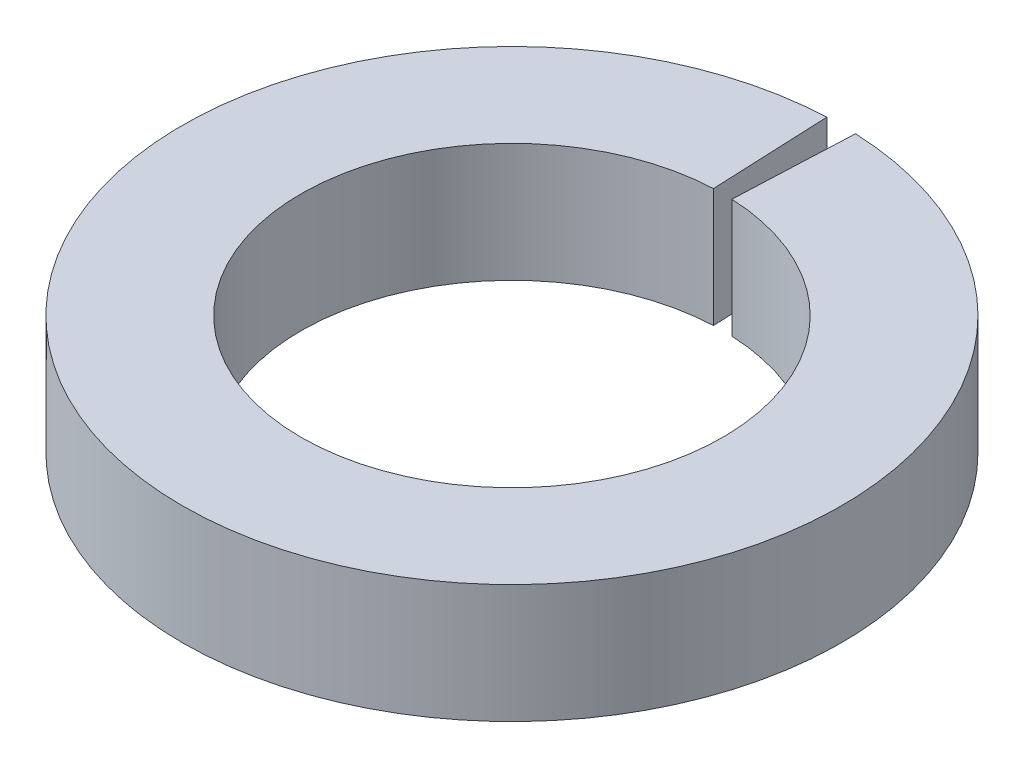
ISO-10303-21;
HEADER;
FILE_DESCRIPTION(('STEP AP214'),'2;1');
FILE_NAME('part.step','',(''),(''),'','','');
FILE_SCHEMA(('AUTOMOTIVE_DESIGN { 1 0 10303 214 1 1 1 1 }'));
ENDSEC;
DATA;
#1=APPLICATION_CONTEXT('core data for automotive mechanical design processes');
#2=APPLICATION_PROTOCOL_DEFINITION('international standard','automotive_design',2000,#1);
#3=PRODUCT_CONTEXT('',#1,'mechanical');
#4=PRODUCT('Part','Part','',(#3));
#5=PRODUCT_RELATED_PRODUCT_CATEGORY('part','',(#4));
#6=PRODUCT_DEFINITION_FORMATION('','',#4);
#7=PRODUCT_DEFINITION_CONTEXT('part definition',#1,'design');
#8=PRODUCT_DEFINITION('design','',#6,#7);
#9=PRODUCT_DEFINITION_SHAPE('','',#8);
#10=(LENGTH_UNIT() NAMED_UNIT(*) SI_UNIT(.MILLI.,.METRE.));
#11=(NAMED_UNIT(*) PLANE_ANGLE_UNIT() SI_UNIT($,.RADIAN.));
#12=(NAMED_UNIT(*) SI_UNIT($,.STERADIAN.) SOLID_ANGLE_UNIT());
#13=UNCERTAINTY_MEASURE_WITH_UNIT(LENGTH_MEASURE(1.E-05),#10,'distance_accuracy_value','');
#14=(GEOMETRIC_REPRESENTATION_CONTEXT(3) GLOBAL_UNCERTAINTY_ASSIGNED_CONTEXT((#13)) GLOBAL_UNIT_ASSIGNED_CONTEXT((#10,
#11,#12)) REPRESENTATION_CONTEXT('',''));
#15=CARTESIAN_POINT('',(0.,0.,0.));
#16=DIRECTION('',(0.,0.,1.));
#17=DIRECTION('',(1.,0.,0.));
#18=AXIS2_PLACEMENT_3D('',#15,#16,#17);
#19=CARTESIAN_POINT('',(0.,0.9,0.));
#20=DIRECTION('',(0.,-1.,0.));
#21=DIRECTION('',(0.,0.,-1.));
#22=AXIS2_PLACEMENT_3D('',#19,#20,#21);
#23=CYLINDRICAL_SURFACE('',#22,1.6);
#24=CARTESIAN_POINT('',(0.,0.,0.));
#25=DIRECTION('',(0.,-1.,0.));
#26=DIRECTION('',(0.,0.,1.));
#27=AXIS2_PLACEMENT_3D('',#24,#25,#26);
#28=CIRCLE('',#27,1.6);
#29=CARTESIAN_POINT('',(0.0697910197845323,0.,-1.59847715453097));
#30=VERTEX_POINT('',#29);
#31=CARTESIAN_POINT('',(-0.0697910197845323,0.,-1.59847715453097));
#32=VERTEX_POINT('',#31);
#33=EDGE_CURVE('E113',#30,#32,#28,.T.);
#34=ORIENTED_EDGE('',*,*,#33,.T.);
#35=DIRECTION('',(0.,-1.,0.));
#36=VECTOR('',#35,1.);
#37=CARTESIAN_POINT('',(-0.0697910197845323,0.9,-1.59847715453097));
#38=LINE('',#37,#36);
#39=CARTESIAN_POINT('',(-0.0697910197845323,0.9,-1.59847715453097));
#40=VERTEX_POINT('',#39);
#41=EDGE_CURVE('E11',#40,#32,#38,.T.);
#42=ORIENTED_EDGE('',*,*,#41,.F.);
#43=CARTESIAN_POINT('',(0.,0.9,0.));
#44=DIRECTION('',(0.,-1.,0.));
#45=DIRECTION('',(0.,0.,1.));
#46=AXIS2_PLACEMENT_3D('',#43,#44,#45);
#47=CIRCLE('',#46,1.6);
#48=CARTESIAN_POINT('',(0.0697910197845323,0.9,-1.59847715453097));
#49=VERTEX_POINT('',#48);
#50=EDGE_CURVE('E97',#49,#40,#47,.T.);
#51=ORIENTED_EDGE('',*,*,#50,.F.);
#52=DIRECTION('',(0.,-1.,0.));
#53=VECTOR('',#52,1.);
#54=CARTESIAN_POINT('',(0.0697910197845323,0.9,-1.59847715453097));
#55=LINE('',#54,#53);
#56=EDGE_CURVE('E109',#49,#30,#55,.T.);
#57=ORIENTED_EDGE('',*,*,#56,.T.);
#58=EDGE_LOOP('',(#34,#42,#51,#57));
#59=FACE_BOUND('',#58,.T.);
#60=ADVANCED_FACE('F45',(#59),#23,.F.);
#61=CARTESIAN_POINT('',(-0.0697910197845323,0.9,-1.59847715453097));
#62=DIRECTION('',(-0.999048221581858,0.,0.0436193873653326));
#63=DIRECTION('',(0.0436193873653326,0.,0.999048221581858));
#64=AXIS2_PLACEMENT_3D('',#61,#62,#63);
#65=PLANE('',#64);
#66=DIRECTION('',(-0.0436193873653326,0.,-0.999048221581858));
#67=VECTOR('',#66,1.);
#68=CARTESIAN_POINT('',(-0.0697910197845323,0.,-1.59847715453097));
#69=LINE('',#68,#67);
#70=CARTESIAN_POINT('',(-0.109048468413332,0.,-2.49762055395465));
#71=VERTEX_POINT('',#70);
#72=EDGE_CURVE('E102',#32,#71,#69,.T.);
#73=ORIENTED_EDGE('',*,*,#72,.T.);
#74=DIRECTION('',(0.,-1.,0.));
#75=VECTOR('',#74,1.);
#76=CARTESIAN_POINT('',(-0.109048468413332,0.9,-2.49762055395465));
#77=LINE('',#76,#75);
#78=CARTESIAN_POINT('',(-0.109048468413332,0.9,-2.49762055395465));
#79=VERTEX_POINT('',#78);
#80=EDGE_CURVE('E54',#79,#71,#77,.T.);
#81=ORIENTED_EDGE('',*,*,#80,.F.);
#82=DIRECTION('',(-0.0436193873653326,0.,-0.999048221581858));
#83=VECTOR('',#82,1.);
#84=CARTESIAN_POINT('',(-0.0697910197845323,0.9,-1.59847715453097));
#85=LINE('',#84,#83);
#86=EDGE_CURVE('E92',#40,#79,#85,.T.);
#87=ORIENTED_EDGE('',*,*,#86,.F.);
#88=ORIENTED_EDGE('',*,*,#41,.T.);
#89=EDGE_LOOP('',(#73,#81,#87,#88));
#90=FACE_BOUND('',#89,.T.);
#91=ADVANCED_FACE('F101',(#90),#65,.F.);
#92=CARTESIAN_POINT('',(0.,0.9,0.));
#93=DIRECTION('',(0.,-1.,0.));
#94=DIRECTION('',(0.,0.,-1.));
#95=AXIS2_PLACEMENT_3D('',#92,#93,#94);
#96=CYLINDRICAL_SURFACE('',#95,2.5);
#97=CARTESIAN_POINT('',(0.,0.,0.));
#98=DIRECTION('',(0.,1.,0.));
#99=DIRECTION('',(0.,0.,1.));
#100=AXIS2_PLACEMENT_3D('',#97,#98,#99);
#101=CIRCLE('',#100,2.5);
#102=CARTESIAN_POINT('',(0.109048468413329,0.,-2.49762055395465));
#103=VERTEX_POINT('',#102);
#104=EDGE_CURVE('E79',#71,#103,#101,.T.);
#105=ORIENTED_EDGE('',*,*,#104,.T.);
#106=DIRECTION('',(0.,-1.,0.));
#107=VECTOR('',#106,1.);
#108=CARTESIAN_POINT('',(0.109048468413329,0.9,-2.49762055395465));
#109=LINE('',#108,#107);
#110=CARTESIAN_POINT('',(0.109048468413329,0.9,-2.49762055395465));
#111=VERTEX_POINT('',#110);
#112=EDGE_CURVE('E104',#111,#103,#109,.T.);
#113=ORIENTED_EDGE('',*,*,#112,.F.);
#114=CARTESIAN_POINT('',(0.,0.9,0.));
#115=DIRECTION('',(0.,1.,0.));
#116=DIRECTION('',(0.,0.,1.));
#117=AXIS2_PLACEMENT_3D('',#114,#115,#116);
#118=CIRCLE('',#117,2.5);
#119=EDGE_CURVE('E95',#79,#111,#118,.T.);
#120=ORIENTED_EDGE('',*,*,#119,.F.);
#121=ORIENTED_EDGE('',*,*,#80,.T.);
#122=EDGE_LOOP('',(#105,#113,#120,#121));
#123=FACE_BOUND('',#122,.T.);
#124=ADVANCED_FACE('F105',(#123),#96,.T.);
#125=CARTESIAN_POINT('',(0.109048468413332,0.9,-2.49762055395465));
#126=DIRECTION('',(0.999048221581858,0.,0.0436193873653326));
#127=DIRECTION('',(0.0436193873653326,0.,-0.999048221581858));
#128=AXIS2_PLACEMENT_3D('',#125,#126,#127);
#129=PLANE('',#128);
#130=DIRECTION('',(-0.0436193873653326,0.,0.999048221581858));
#131=VECTOR('',#130,1.);
#132=CARTESIAN_POINT('',(0.109048468413332,0.,-2.49762055395465));
#133=LINE('',#132,#131);
#134=EDGE_CURVE('E85',#103,#30,#133,.T.);
#135=ORIENTED_EDGE('',*,*,#134,.T.);
#136=ORIENTED_EDGE('',*,*,#56,.F.);
#137=DIRECTION('',(-0.0436193873653326,0.,0.999048221581858));
#138=VECTOR('',#137,1.);
#139=CARTESIAN_POINT('',(0.109048468413332,0.9,-2.49762055395465));
#140=LINE('',#139,#138);
#141=EDGE_CURVE('E62',#111,#49,#140,.T.);
#142=ORIENTED_EDGE('',*,*,#141,.F.);
#143=ORIENTED_EDGE('',*,*,#112,.T.);
#144=EDGE_LOOP('',(#135,#136,#142,#143));
#145=FACE_BOUND('',#144,.T.);
#146=ADVANCED_FACE('F126',(#145),#129,.F.);
#147=CARTESIAN_POINT('',(0.,0.9,0.));
#148=DIRECTION('',(0.,1.,0.));
#149=DIRECTION('',(0.,0.,1.));
#150=AXIS2_PLACEMENT_3D('',#147,#148,#149);
#151=PLANE('',#150);
#152=ORIENTED_EDGE('',*,*,#50,.T.);
#153=ORIENTED_EDGE('',*,*,#86,.T.);
#154=ORIENTED_EDGE('',*,*,#119,.T.);
#155=ORIENTED_EDGE('',*,*,#141,.T.);
#156=EDGE_LOOP('',(#152,#153,#154,#155));
#157=FACE_BOUND('',#156,.T.);
#158=ADVANCED_FACE('F93',(#157),#151,.T.);
#159=CARTESIAN_POINT('',(0.,0.,0.));
#160=DIRECTION('',(0.,1.,0.));
#161=DIRECTION('',(0.,0.,1.));
#162=AXIS2_PLACEMENT_3D('',#159,#160,#161);
#163=PLANE('',#162);
#164=ORIENTED_EDGE('',*,*,#33,.F.);
#165=ORIENTED_EDGE('',*,*,#134,.F.);
#166=ORIENTED_EDGE('',*,*,#104,.F.);
#167=ORIENTED_EDGE('',*,*,#72,.F.);
#168=EDGE_LOOP('',(#164,#165,#166,#167));
#169=FACE_BOUND('',#168,.T.);
#170=ADVANCED_FACE('F129',(#169),#163,.F.);
#171=CLOSED_SHELL('',(#60,#91,#124,#146,#158,#170));
#172=MANIFOLD_SOLID_BREP('B2',#171);
#173=ADVANCED_BREP_SHAPE_REPRESENTATION('',(#18,#172),#14);
#174=SHAPE_DEFINITION_REPRESENTATION(#9,#173);
ENDSEC;
END-ISO-10303-21;
